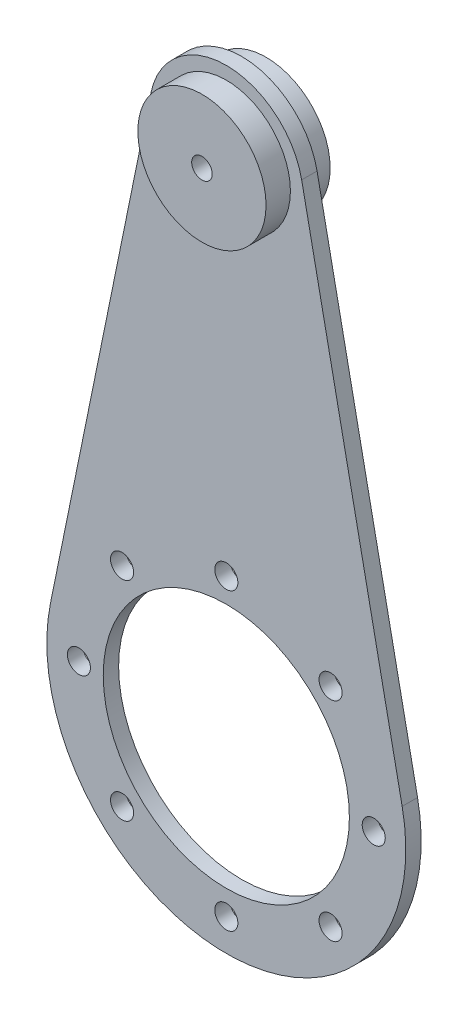
ISO-10303-21;
HEADER;
FILE_DESCRIPTION(('STEP AP214'),'2;1');
FILE_NAME('part.step','',(''),(''),'','','');
FILE_SCHEMA(('AUTOMOTIVE_DESIGN { 1 0 10303 214 1 1 1 1 }'));
ENDSEC;
DATA;
#1=APPLICATION_CONTEXT('core data for automotive mechanical design processes');
#2=APPLICATION_PROTOCOL_DEFINITION('international standard','automotive_design',2000,#1);
#3=PRODUCT_CONTEXT('',#1,'mechanical');
#4=PRODUCT('Part','Part','',(#3));
#5=PRODUCT_RELATED_PRODUCT_CATEGORY('part','',(#4));
#6=PRODUCT_DEFINITION_FORMATION('','',#4);
#7=PRODUCT_DEFINITION_CONTEXT('part definition',#1,'design');
#8=PRODUCT_DEFINITION('design','',#6,#7);
#9=PRODUCT_DEFINITION_SHAPE('','',#8);
#10=(LENGTH_UNIT() NAMED_UNIT(*) SI_UNIT(.MILLI.,.METRE.));
#11=(NAMED_UNIT(*) PLANE_ANGLE_UNIT() SI_UNIT($,.RADIAN.));
#12=(NAMED_UNIT(*) SI_UNIT($,.STERADIAN.) SOLID_ANGLE_UNIT());
#13=UNCERTAINTY_MEASURE_WITH_UNIT(LENGTH_MEASURE(1.E-05),#10,'distance_accuracy_value','');
#14=(GEOMETRIC_REPRESENTATION_CONTEXT(3) GLOBAL_UNCERTAINTY_ASSIGNED_CONTEXT((#13)) GLOBAL_UNIT_ASSIGNED_CONTEXT((#10,
#11,#12)) REPRESENTATION_CONTEXT('',''));
#15=CARTESIAN_POINT('',(0.,0.,0.));
#16=DIRECTION('',(0.,0.,1.));
#17=DIRECTION('',(1.,0.,0.));
#18=AXIS2_PLACEMENT_3D('',#15,#16,#17);
#19=CARTESIAN_POINT('',(0.,0.,-12.5));
#20=DIRECTION('',(0.,0.,1.));
#21=DIRECTION('',(1.,0.,0.));
#22=AXIS2_PLACEMENT_3D('',#19,#20,#21);
#23=PLANE('',#22);
#24=CARTESIAN_POINT('',(0.,200.,-12.5));
#25=DIRECTION('',(0.,0.,1.));
#26=DIRECTION('',(1.,0.,0.));
#27=AXIS2_PLACEMENT_3D('',#24,#25,#26);
#28=CIRCLE('',#27,4.);
#29=CARTESIAN_POINT('',(4.00000000000003,200.,-12.5));
#30=VERTEX_POINT('',#29);
#31=EDGE_CURVE('E20',#30,#30,#28,.T.);
#32=ORIENTED_EDGE('',*,*,#31,.T.);
#33=EDGE_LOOP('',(#32));
#34=FACE_BOUND('',#33,.T.);
#35=CARTESIAN_POINT('',(0.,200.,-12.5));
#36=DIRECTION('',(0.,0.,1.));
#37=DIRECTION('',(1.,0.,0.));
#38=AXIS2_PLACEMENT_3D('',#35,#36,#37);
#39=CIRCLE('',#38,25.);
#40=CARTESIAN_POINT('',(25.,200.,-12.5));
#41=VERTEX_POINT('',#40);
#42=EDGE_CURVE('E152',#41,#41,#39,.T.);
#43=ORIENTED_EDGE('',*,*,#42,.F.);
#44=EDGE_LOOP('',(#43));
#45=FACE_BOUND('',#44,.T.);
#46=ADVANCED_FACE('F17',(#34,#45),#23,.F.);
#47=CARTESIAN_POINT('',(0.,200.,-12.5));
#48=DIRECTION('',(0.,0.,1.));
#49=DIRECTION('',(1.,0.,0.));
#50=AXIS2_PLACEMENT_3D('',#47,#48,#49);
#51=CYLINDRICAL_SURFACE('',#50,4.);
#52=ORIENTED_EDGE('',*,*,#31,.F.);
#53=EDGE_LOOP('',(#52));
#54=FACE_BOUND('',#53,.T.);
#55=CARTESIAN_POINT('',(0.,200.,12.5));
#56=DIRECTION('',(0.,0.,1.));
#57=DIRECTION('',(1.,0.,0.));
#58=AXIS2_PLACEMENT_3D('',#55,#56,#57);
#59=CIRCLE('',#58,4.);
#60=CARTESIAN_POINT('',(4.00000000000003,200.,12.5));
#61=VERTEX_POINT('',#60);
#62=EDGE_CURVE('E150',#61,#61,#59,.F.);
#63=ORIENTED_EDGE('',*,*,#62,.F.);
#64=EDGE_LOOP('',(#63));
#65=FACE_BOUND('',#64,.T.);
#66=ADVANCED_FACE('F161',(#54,#65),#51,.F.);
#67=CARTESIAN_POINT('',(0.,200.,-12.5));
#68=DIRECTION('',(0.,0.,1.));
#69=DIRECTION('',(1.,0.,0.));
#70=AXIS2_PLACEMENT_3D('',#67,#68,#69);
#71=CYLINDRICAL_SURFACE('',#70,25.);
#72=ORIENTED_EDGE('',*,*,#42,.T.);
#73=EDGE_LOOP('',(#72));
#74=FACE_BOUND('',#73,.T.);
#75=CARTESIAN_POINT('',(0.,200.,-3.));
#76=DIRECTION('',(0.,0.,1.));
#77=DIRECTION('',(1.,0.,0.));
#78=AXIS2_PLACEMENT_3D('',#75,#76,#77);
#79=CIRCLE('',#78,25.);
#80=CARTESIAN_POINT('',(25.,200.,-3.));
#81=VERTEX_POINT('',#80);
#82=EDGE_CURVE('E65',#81,#81,#79,.F.);
#83=ORIENTED_EDGE('',*,*,#82,.T.);
#84=EDGE_LOOP('',(#83));
#85=FACE_BOUND('',#84,.T.);
#86=ADVANCED_FACE('F164',(#74,#85),#71,.T.);
#87=CARTESIAN_POINT('',(0.,0.,12.5));
#88=DIRECTION('',(0.,0.,1.));
#89=DIRECTION('',(1.,0.,0.));
#90=AXIS2_PLACEMENT_3D('',#87,#88,#89);
#91=PLANE('',#90);
#92=ORIENTED_EDGE('',*,*,#62,.T.);
#93=EDGE_LOOP('',(#92));
#94=FACE_BOUND('',#93,.T.);
#95=CARTESIAN_POINT('',(0.,200.,12.5));
#96=DIRECTION('',(0.,0.,1.));
#97=DIRECTION('',(1.,0.,0.));
#98=AXIS2_PLACEMENT_3D('',#95,#96,#97);
#99=CIRCLE('',#98,25.);
#100=CARTESIAN_POINT('',(25.,200.,12.5));
#101=VERTEX_POINT('',#100);
#102=EDGE_CURVE('E123',#101,#101,#99,.F.);
#103=ORIENTED_EDGE('',*,*,#102,.F.);
#104=EDGE_LOOP('',(#103));
#105=FACE_BOUND('',#104,.T.);
#106=ADVANCED_FACE('F167',(#94,#105),#91,.T.);
#107=CARTESIAN_POINT('',(0.,0.,-3.));
#108=DIRECTION('',(0.,0.,1.));
#109=DIRECTION('',(1.,0.,0.));
#110=AXIS2_PLACEMENT_3D('',#107,#108,#109);
#111=PLANE('',#110);
#112=CARTESIAN_POINT('',(57.5,0.,-3.));
#113=DIRECTION('',(0.,0.,1.));
#114=DIRECTION('',(1.,0.,0.));
#115=AXIS2_PLACEMENT_3D('',#112,#113,#114);
#116=CIRCLE('',#115,4.5);
#117=CARTESIAN_POINT('',(62.,0.,-3.));
#118=VERTEX_POINT('',#117);
#119=EDGE_CURVE('E117',#118,#118,#116,.T.);
#120=ORIENTED_EDGE('',*,*,#119,.T.);
#121=EDGE_LOOP('',(#120));
#122=FACE_BOUND('',#121,.T.);
#123=CARTESIAN_POINT('',(0.,0.,-3.));
#124=DIRECTION('',(0.,0.,1.));
#125=DIRECTION('',(1.,0.,0.));
#126=AXIS2_PLACEMENT_3D('',#123,#124,#125);
#127=CIRCLE('',#126,48.);
#128=CARTESIAN_POINT('',(48.,0.,-3.));
#129=VERTEX_POINT('',#128);
#130=EDGE_CURVE('E120',#129,#129,#127,.T.);
#131=ORIENTED_EDGE('',*,*,#130,.T.);
#132=EDGE_LOOP('',(#131));
#133=FACE_BOUND('',#132,.T.);
#134=ORIENTED_EDGE('',*,*,#82,.F.);
#135=EDGE_LOOP('',(#134));
#136=FACE_BOUND('',#135,.T.);
#137=CARTESIAN_POINT('',(40.6586399182265,-40.6586399182265,-3.));
#138=DIRECTION('',(0.,0.,1.));
#139=DIRECTION('',(1.,0.,0.));
#140=AXIS2_PLACEMENT_3D('',#137,#138,#139);
#141=CIRCLE('',#140,4.5);
#142=CARTESIAN_POINT('',(45.1586399182265,-40.6586399182265,-3.));
#143=VERTEX_POINT('',#142);
#144=EDGE_CURVE('E126',#143,#143,#141,.T.);
#145=ORIENTED_EDGE('',*,*,#144,.T.);
#146=EDGE_LOOP('',(#145));
#147=FACE_BOUND('',#146,.T.);
#148=CARTESIAN_POINT('',(0.,-57.5,-3.));
#149=DIRECTION('',(0.,0.,1.));
#150=DIRECTION('',(1.,0.,0.));
#151=AXIS2_PLACEMENT_3D('',#148,#149,#150);
#152=CIRCLE('',#151,4.5);
#153=CARTESIAN_POINT('',(4.49999999999999,-57.5,-3.));
#154=VERTEX_POINT('',#153);
#155=EDGE_CURVE('E129',#154,#154,#152,.T.);
#156=ORIENTED_EDGE('',*,*,#155,.T.);
#157=EDGE_LOOP('',(#156));
#158=FACE_BOUND('',#157,.T.);
#159=CARTESIAN_POINT('',(-40.6586399182265,-40.6586399182265,-3.));
#160=DIRECTION('',(0.,0.,1.));
#161=DIRECTION('',(1.,0.,0.));
#162=AXIS2_PLACEMENT_3D('',#159,#160,#161);
#163=CIRCLE('',#162,4.5);
#164=CARTESIAN_POINT('',(-36.1586399182265,-40.6586399182265,-3.));
#165=VERTEX_POINT('',#164);
#166=EDGE_CURVE('E132',#165,#165,#163,.T.);
#167=ORIENTED_EDGE('',*,*,#166,.T.);
#168=EDGE_LOOP('',(#167));
#169=FACE_BOUND('',#168,.T.);
#170=CARTESIAN_POINT('',(-57.5,0.,-3.));
#171=DIRECTION('',(0.,0.,1.));
#172=DIRECTION('',(1.,0.,0.));
#173=AXIS2_PLACEMENT_3D('',#170,#171,#172);
#174=CIRCLE('',#173,4.5);
#175=CARTESIAN_POINT('',(-53.,0.,-3.));
#176=VERTEX_POINT('',#175);
#177=EDGE_CURVE('E135',#176,#176,#174,.T.);
#178=ORIENTED_EDGE('',*,*,#177,.T.);
#179=EDGE_LOOP('',(#178));
#180=FACE_BOUND('',#179,.T.);
#181=CARTESIAN_POINT('',(-40.6586399182265,40.6586399182265,-3.));
#182=DIRECTION('',(0.,0.,1.));
#183=DIRECTION('',(1.,0.,0.));
#184=AXIS2_PLACEMENT_3D('',#181,#182,#183);
#185=CIRCLE('',#184,4.5);
#186=CARTESIAN_POINT('',(-36.1586399182265,40.6586399182265,-3.));
#187=VERTEX_POINT('',#186);
#188=EDGE_CURVE('E138',#187,#187,#185,.T.);
#189=ORIENTED_EDGE('',*,*,#188,.T.);
#190=EDGE_LOOP('',(#189));
#191=FACE_BOUND('',#190,.T.);
#192=CARTESIAN_POINT('',(0.,57.5,-3.));
#193=DIRECTION('',(0.,0.,1.));
#194=DIRECTION('',(1.,0.,0.));
#195=AXIS2_PLACEMENT_3D('',#192,#193,#194);
#196=CIRCLE('',#195,4.5);
#197=CARTESIAN_POINT('',(4.50000000000001,57.5,-3.));
#198=VERTEX_POINT('',#197);
#199=EDGE_CURVE('E141',#198,#198,#196,.T.);
#200=ORIENTED_EDGE('',*,*,#199,.T.);
#201=EDGE_LOOP('',(#200));
#202=FACE_BOUND('',#201,.T.);
#203=CARTESIAN_POINT('',(40.6586399182265,40.6586399182265,-3.));
#204=DIRECTION('',(0.,0.,1.));
#205=DIRECTION('',(1.,0.,0.));
#206=AXIS2_PLACEMENT_3D('',#203,#204,#205);
#207=CIRCLE('',#206,4.5);
#208=CARTESIAN_POINT('',(45.1586399182265,40.6586399182265,-3.));
#209=VERTEX_POINT('',#208);
#210=EDGE_CURVE('E144',#209,#209,#207,.T.);
#211=ORIENTED_EDGE('',*,*,#210,.T.);
#212=EDGE_LOOP('',(#211));
#213=FACE_BOUND('',#212,.T.);
#214=CARTESIAN_POINT('',(0.,200.,-3.));
#215=DIRECTION('',(0.,0.,1.));
#216=DIRECTION('',(1.,0.,0.));
#217=AXIS2_PLACEMENT_3D('',#214,#215,#216);
#218=CIRCLE('',#217,30.);
#219=CARTESIAN_POINT('',(29.3938769133968,206.000000000007,-3.));
#220=VERTEX_POINT('',#219);
#221=CARTESIAN_POINT('',(-29.3938769133966,206.000000000007,-3.));
#222=VERTEX_POINT('',#221);
#223=EDGE_CURVE('E79',#220,#222,#218,.T.);
#224=ORIENTED_EDGE('',*,*,#223,.F.);
#225=DIRECTION('',(-0.200000000000448,0.97979589711318,0.));
#226=VECTOR('',#225,1.);
#227=CARTESIAN_POINT('',(68.5857127980534,13.9999999998386,-3.));
#228=LINE('',#227,#226);
#229=CARTESIAN_POINT('',(68.5857127980319,13.9999999999439,-3.));
#230=VERTEX_POINT('',#229);
#231=EDGE_CURVE('E62',#230,#220,#228,.T.);
#232=ORIENTED_EDGE('',*,*,#231,.F.);
#233=CARTESIAN_POINT('',(0.,0.,-3.));
#234=DIRECTION('',(0.,0.,1.));
#235=DIRECTION('',(1.,0.,0.));
#236=AXIS2_PLACEMENT_3D('',#233,#234,#235);
#237=CIRCLE('',#236,70.);
#238=CARTESIAN_POINT('',(-68.5857127980319,13.999999999944,-3.));
#239=VERTEX_POINT('',#238);
#240=EDGE_CURVE('E56',#239,#230,#237,.T.);
#241=ORIENTED_EDGE('',*,*,#240,.F.);
#242=DIRECTION('',(-0.200000000000449,-0.97979589711318,0.));
#243=VECTOR('',#242,1.);
#244=CARTESIAN_POINT('',(-29.393876913398,206.,-3.));
#245=LINE('',#244,#243);
#246=EDGE_CURVE('E60',#222,#239,#245,.T.);
#247=ORIENTED_EDGE('',*,*,#246,.F.);
#248=EDGE_LOOP('',(#224,#232,#241,#247));
#249=FACE_BOUND('',#248,.T.);
#250=ADVANCED_FACE('F58',(#122,#133,#136,#147,#158,#169,#180,#191,#202,#213,#249),#111,.F.);
#251=CARTESIAN_POINT('',(0.,0.,-3.));
#252=DIRECTION('',(0.,0.,1.));
#253=DIRECTION('',(1.,0.,0.));
#254=AXIS2_PLACEMENT_3D('',#251,#252,#253);
#255=CYLINDRICAL_SURFACE('',#254,70.);
#256=CARTESIAN_POINT('',(0.,0.,3.));
#257=DIRECTION('',(0.,0.,1.));
#258=DIRECTION('',(1.,0.,0.));
#259=AXIS2_PLACEMENT_3D('',#256,#257,#258);
#260=CIRCLE('',#259,70.);
#261=CARTESIAN_POINT('',(-68.5857127979912,13.9999999999194,3.));
#262=VERTEX_POINT('',#261);
#263=CARTESIAN_POINT('',(68.5857127980319,13.9999999999439,3.));
#264=VERTEX_POINT('',#263);
#265=EDGE_CURVE('E71',#262,#264,#260,.T.);
#266=ORIENTED_EDGE('',*,*,#265,.F.);
#267=DIRECTION('',(0.,0.,1.));
#268=VECTOR('',#267,1.);
#269=CARTESIAN_POINT('',(-68.5857127980534,13.9999999998387,-3.));
#270=LINE('',#269,#268);
#271=EDGE_CURVE('E68',#239,#262,#270,.T.);
#272=ORIENTED_EDGE('',*,*,#271,.F.);
#273=ORIENTED_EDGE('',*,*,#240,.T.);
#274=DIRECTION('',(0.,0.,1.));
#275=VECTOR('',#274,1.);
#276=CARTESIAN_POINT('',(68.5857127980534,13.9999999998386,-3.));
#277=LINE('',#276,#275);
#278=EDGE_CURVE('E83',#264,#230,#277,.F.);
#279=ORIENTED_EDGE('',*,*,#278,.F.);
#280=EDGE_LOOP('',(#266,#272,#273,#279));
#281=FACE_BOUND('',#280,.T.);
#282=ADVANCED_FACE('F69',(#281),#255,.T.);
#283=CARTESIAN_POINT('',(68.5857127980534,13.9999999998386,-3.));
#284=DIRECTION('',(0.97979589711318,0.200000000000448,0.));
#285=DIRECTION('',(-0.200000000000448,0.97979589711318,0.));
#286=AXIS2_PLACEMENT_3D('',#283,#284,#285);
#287=PLANE('',#286);
#288=DIRECTION('',(-0.200000000000448,0.97979589711318,0.));
#289=VECTOR('',#288,1.);
#290=CARTESIAN_POINT('',(68.5857127980534,13.9999999998386,3.));
#291=LINE('',#290,#289);
#292=CARTESIAN_POINT('',(29.3938769133967,206.000000000007,3.));
#293=VERTEX_POINT('',#292);
#294=EDGE_CURVE('E115',#264,#293,#291,.T.);
#295=ORIENTED_EDGE('',*,*,#294,.F.);
#296=ORIENTED_EDGE('',*,*,#278,.T.);
#297=ORIENTED_EDGE('',*,*,#231,.T.);
#298=DIRECTION('',(0.,0.,1.));
#299=VECTOR('',#298,1.);
#300=CARTESIAN_POINT('',(29.3938769133982,206.,-3.));
#301=LINE('',#300,#299);
#302=EDGE_CURVE('E76',#293,#220,#301,.F.);
#303=ORIENTED_EDGE('',*,*,#302,.F.);
#304=EDGE_LOOP('',(#295,#296,#297,#303));
#305=FACE_BOUND('',#304,.T.);
#306=ADVANCED_FACE('F223',(#305),#287,.T.);
#307=CARTESIAN_POINT('',(0.,200.,-3.));
#308=DIRECTION('',(0.,0.,1.));
#309=DIRECTION('',(1.,0.,0.));
#310=AXIS2_PLACEMENT_3D('',#307,#308,#309);
#311=CYLINDRICAL_SURFACE('',#310,30.);
#312=CARTESIAN_POINT('',(0.,200.,3.));
#313=DIRECTION('',(0.,0.,1.));
#314=DIRECTION('',(1.,0.,0.));
#315=AXIS2_PLACEMENT_3D('',#312,#313,#314);
#316=CIRCLE('',#315,30.);
#317=CARTESIAN_POINT('',(-29.393876913398,206.,3.));
#318=VERTEX_POINT('',#317);
#319=EDGE_CURVE('E112',#293,#318,#316,.T.);
#320=ORIENTED_EDGE('',*,*,#319,.F.);
#321=ORIENTED_EDGE('',*,*,#302,.T.);
#322=ORIENTED_EDGE('',*,*,#223,.T.);
#323=DIRECTION('',(0.,0.,1.));
#324=VECTOR('',#323,1.);
#325=CARTESIAN_POINT('',(-29.393876913398,206.,-3.));
#326=LINE('',#325,#324);
#327=EDGE_CURVE('E35',#318,#222,#326,.F.);
#328=ORIENTED_EDGE('',*,*,#327,.F.);
#329=EDGE_LOOP('',(#320,#321,#322,#328));
#330=FACE_BOUND('',#329,.T.);
#331=ADVANCED_FACE('F221',(#330),#311,.T.);
#332=CARTESIAN_POINT('',(-29.393876913398,206.,-3.));
#333=DIRECTION('',(-0.97979589711318,0.200000000000449,0.));
#334=DIRECTION('',(-0.200000000000449,-0.97979589711318,0.));
#335=AXIS2_PLACEMENT_3D('',#332,#333,#334);
#336=PLANE('',#335);
#337=DIRECTION('',(-0.200000000000001,-0.979795897113271,0.));
#338=VECTOR('',#337,1.);
#339=CARTESIAN_POINT('',(-29.393876913398,206.,3.));
#340=LINE('',#339,#338);
#341=EDGE_CURVE('E111',#318,#262,#340,.T.);
#342=ORIENTED_EDGE('',*,*,#341,.F.);
#343=ORIENTED_EDGE('',*,*,#327,.T.);
#344=ORIENTED_EDGE('',*,*,#246,.T.);
#345=ORIENTED_EDGE('',*,*,#271,.T.);
#346=EDGE_LOOP('',(#342,#343,#344,#345));
#347=FACE_BOUND('',#346,.T.);
#348=ADVANCED_FACE('F75',(#347),#336,.T.);
#349=CARTESIAN_POINT('',(40.6586399182265,40.6586399182265,-12.5));
#350=DIRECTION('',(0.,0.,1.));
#351=DIRECTION('',(1.,0.,0.));
#352=AXIS2_PLACEMENT_3D('',#349,#350,#351);
#353=CYLINDRICAL_SURFACE('',#352,4.5);
#354=ORIENTED_EDGE('',*,*,#210,.F.);
#355=EDGE_LOOP('',(#354));
#356=FACE_BOUND('',#355,.T.);
#357=CARTESIAN_POINT('',(40.6586399182265,40.6586399182265,3.));
#358=DIRECTION('',(0.,0.,1.));
#359=DIRECTION('',(1.,0.,0.));
#360=AXIS2_PLACEMENT_3D('',#357,#358,#359);
#361=CIRCLE('',#360,4.5);
#362=CARTESIAN_POINT('',(45.1586399182265,40.6586399182265,3.));
#363=VERTEX_POINT('',#362);
#364=EDGE_CURVE('E108',#363,#363,#361,.F.);
#365=ORIENTED_EDGE('',*,*,#364,.F.);
#366=EDGE_LOOP('',(#365));
#367=FACE_BOUND('',#366,.T.);
#368=ADVANCED_FACE('F261',(#356,#367),#353,.F.);
#369=CARTESIAN_POINT('',(0.,57.5,-12.5));
#370=DIRECTION('',(0.,0.,1.));
#371=DIRECTION('',(1.,0.,0.));
#372=AXIS2_PLACEMENT_3D('',#369,#370,#371);
#373=CYLINDRICAL_SURFACE('',#372,4.5);
#374=ORIENTED_EDGE('',*,*,#199,.F.);
#375=EDGE_LOOP('',(#374));
#376=FACE_BOUND('',#375,.T.);
#377=CARTESIAN_POINT('',(0.,57.5,3.));
#378=DIRECTION('',(0.,0.,1.));
#379=DIRECTION('',(1.,0.,0.));
#380=AXIS2_PLACEMENT_3D('',#377,#378,#379);
#381=CIRCLE('',#380,4.5);
#382=CARTESIAN_POINT('',(4.50000000000001,57.5,3.));
#383=VERTEX_POINT('',#382);
#384=EDGE_CURVE('E105',#383,#383,#381,.F.);
#385=ORIENTED_EDGE('',*,*,#384,.F.);
#386=EDGE_LOOP('',(#385));
#387=FACE_BOUND('',#386,.T.);
#388=ADVANCED_FACE('F264',(#376,#387),#373,.F.);
#389=CARTESIAN_POINT('',(-40.6586399182265,40.6586399182265,-12.5));
#390=DIRECTION('',(0.,0.,1.));
#391=DIRECTION('',(1.,0.,0.));
#392=AXIS2_PLACEMENT_3D('',#389,#390,#391);
#393=CYLINDRICAL_SURFACE('',#392,4.5);
#394=ORIENTED_EDGE('',*,*,#188,.F.);
#395=EDGE_LOOP('',(#394));
#396=FACE_BOUND('',#395,.T.);
#397=CARTESIAN_POINT('',(-40.6586399182265,40.6586399182265,3.));
#398=DIRECTION('',(0.,0.,1.));
#399=DIRECTION('',(1.,0.,0.));
#400=AXIS2_PLACEMENT_3D('',#397,#398,#399);
#401=CIRCLE('',#400,4.5);
#402=CARTESIAN_POINT('',(-36.1586399182265,40.6586399182265,3.));
#403=VERTEX_POINT('',#402);
#404=EDGE_CURVE('E102',#403,#403,#401,.F.);
#405=ORIENTED_EDGE('',*,*,#404,.F.);
#406=EDGE_LOOP('',(#405));
#407=FACE_BOUND('',#406,.T.);
#408=ADVANCED_FACE('F270',(#396,#407),#393,.F.);
#409=CARTESIAN_POINT('',(-57.5,0.,-12.5));
#410=DIRECTION('',(0.,0.,1.));
#411=DIRECTION('',(1.,0.,0.));
#412=AXIS2_PLACEMENT_3D('',#409,#410,#411);
#413=CYLINDRICAL_SURFACE('',#412,4.5);
#414=ORIENTED_EDGE('',*,*,#177,.F.);
#415=EDGE_LOOP('',(#414));
#416=FACE_BOUND('',#415,.T.);
#417=CARTESIAN_POINT('',(-57.5,0.,3.));
#418=DIRECTION('',(0.,0.,1.));
#419=DIRECTION('',(1.,0.,0.));
#420=AXIS2_PLACEMENT_3D('',#417,#418,#419);
#421=CIRCLE('',#420,4.5);
#422=CARTESIAN_POINT('',(-53.,0.,3.));
#423=VERTEX_POINT('',#422);
#424=EDGE_CURVE('E99',#423,#423,#421,.F.);
#425=ORIENTED_EDGE('',*,*,#424,.F.);
#426=EDGE_LOOP('',(#425));
#427=FACE_BOUND('',#426,.T.);
#428=ADVANCED_FACE('F276',(#416,#427),#413,.F.);
#429=CARTESIAN_POINT('',(-40.6586399182265,-40.6586399182265,-12.5));
#430=DIRECTION('',(0.,0.,1.));
#431=DIRECTION('',(1.,0.,0.));
#432=AXIS2_PLACEMENT_3D('',#429,#430,#431);
#433=CYLINDRICAL_SURFACE('',#432,4.5);
#434=ORIENTED_EDGE('',*,*,#166,.F.);
#435=EDGE_LOOP('',(#434));
#436=FACE_BOUND('',#435,.T.);
#437=CARTESIAN_POINT('',(-40.6586399182265,-40.6586399182265,3.));
#438=DIRECTION('',(0.,0.,1.));
#439=DIRECTION('',(1.,0.,0.));
#440=AXIS2_PLACEMENT_3D('',#437,#438,#439);
#441=CIRCLE('',#440,4.5);
#442=CARTESIAN_POINT('',(-36.1586399182265,-40.6586399182265,3.));
#443=VERTEX_POINT('',#442);
#444=EDGE_CURVE('E96',#443,#443,#441,.F.);
#445=ORIENTED_EDGE('',*,*,#444,.F.);
#446=EDGE_LOOP('',(#445));
#447=FACE_BOUND('',#446,.T.);
#448=ADVANCED_FACE('F280',(#436,#447),#433,.F.);
#449=CARTESIAN_POINT('',(0.,-57.5,-12.5));
#450=DIRECTION('',(0.,0.,1.));
#451=DIRECTION('',(1.,0.,0.));
#452=AXIS2_PLACEMENT_3D('',#449,#450,#451);
#453=CYLINDRICAL_SURFACE('',#452,4.5);
#454=ORIENTED_EDGE('',*,*,#155,.F.);
#455=EDGE_LOOP('',(#454));
#456=FACE_BOUND('',#455,.T.);
#457=CARTESIAN_POINT('',(0.,-57.5,3.));
#458=DIRECTION('',(0.,0.,1.));
#459=DIRECTION('',(1.,0.,0.));
#460=AXIS2_PLACEMENT_3D('',#457,#458,#459);
#461=CIRCLE('',#460,4.5);
#462=CARTESIAN_POINT('',(4.49999999999999,-57.5,3.));
#463=VERTEX_POINT('',#462);
#464=EDGE_CURVE('E93',#463,#463,#461,.F.);
#465=ORIENTED_EDGE('',*,*,#464,.F.);
#466=EDGE_LOOP('',(#465));
#467=FACE_BOUND('',#466,.T.);
#468=ADVANCED_FACE('F187',(#456,#467),#453,.F.);
#469=CARTESIAN_POINT('',(40.6586399182265,-40.6586399182265,-12.5));
#470=DIRECTION('',(0.,0.,1.));
#471=DIRECTION('',(1.,0.,0.));
#472=AXIS2_PLACEMENT_3D('',#469,#470,#471);
#473=CYLINDRICAL_SURFACE('',#472,4.5);
#474=ORIENTED_EDGE('',*,*,#144,.F.);
#475=EDGE_LOOP('',(#474));
#476=FACE_BOUND('',#475,.T.);
#477=CARTESIAN_POINT('',(40.6586399182265,-40.6586399182265,3.));
#478=DIRECTION('',(0.,0.,1.));
#479=DIRECTION('',(1.,0.,0.));
#480=AXIS2_PLACEMENT_3D('',#477,#478,#479);
#481=CIRCLE('',#480,4.5);
#482=CARTESIAN_POINT('',(45.1586399182265,-40.6586399182265,3.));
#483=VERTEX_POINT('',#482);
#484=EDGE_CURVE('E90',#483,#483,#481,.F.);
#485=ORIENTED_EDGE('',*,*,#484,.F.);
#486=EDGE_LOOP('',(#485));
#487=FACE_BOUND('',#486,.T.);
#488=ADVANCED_FACE('F176',(#476,#487),#473,.F.);
#489=CARTESIAN_POINT('',(0.,200.,-12.5));
#490=DIRECTION('',(0.,0.,1.));
#491=DIRECTION('',(1.,0.,0.));
#492=AXIS2_PLACEMENT_3D('',#489,#490,#491);
#493=CYLINDRICAL_SURFACE('',#492,25.);
#494=CARTESIAN_POINT('',(0.,200.,3.));
#495=DIRECTION('',(0.,0.,1.));
#496=DIRECTION('',(1.,0.,0.));
#497=AXIS2_PLACEMENT_3D('',#494,#495,#496);
#498=CIRCLE('',#497,25.);
#499=CARTESIAN_POINT('',(25.,200.,3.));
#500=VERTEX_POINT('',#499);
#501=EDGE_CURVE('E87',#500,#500,#498,.F.);
#502=ORIENTED_EDGE('',*,*,#501,.F.);
#503=EDGE_LOOP('',(#502));
#504=FACE_BOUND('',#503,.T.);
#505=ORIENTED_EDGE('',*,*,#102,.T.);
#506=EDGE_LOOP('',(#505));
#507=FACE_BOUND('',#506,.T.);
#508=ADVANCED_FACE('F173',(#504,#507),#493,.T.);
#509=CARTESIAN_POINT('',(0.,0.,-3.));
#510=DIRECTION('',(0.,0.,1.));
#511=DIRECTION('',(1.,0.,0.));
#512=AXIS2_PLACEMENT_3D('',#509,#510,#511);
#513=CYLINDRICAL_SURFACE('',#512,48.);
#514=ORIENTED_EDGE('',*,*,#130,.F.);
#515=EDGE_LOOP('',(#514));
#516=FACE_BOUND('',#515,.T.);
#517=CARTESIAN_POINT('',(0.,0.,3.));
#518=DIRECTION('',(0.,0.,1.));
#519=DIRECTION('',(1.,0.,0.));
#520=AXIS2_PLACEMENT_3D('',#517,#518,#519);
#521=CIRCLE('',#520,48.);
#522=CARTESIAN_POINT('',(48.,0.,3.));
#523=VERTEX_POINT('',#522);
#524=EDGE_CURVE('E26',#523,#523,#521,.F.);
#525=ORIENTED_EDGE('',*,*,#524,.F.);
#526=EDGE_LOOP('',(#525));
#527=FACE_BOUND('',#526,.T.);
#528=ADVANCED_FACE('F175',(#516,#527),#513,.F.);
#529=CARTESIAN_POINT('',(57.5,0.,-12.5));
#530=DIRECTION('',(0.,0.,1.));
#531=DIRECTION('',(1.,0.,0.));
#532=AXIS2_PLACEMENT_3D('',#529,#530,#531);
#533=CYLINDRICAL_SURFACE('',#532,4.5);
#534=ORIENTED_EDGE('',*,*,#119,.F.);
#535=EDGE_LOOP('',(#534));
#536=FACE_BOUND('',#535,.T.);
#537=CARTESIAN_POINT('',(57.5,0.,3.));
#538=DIRECTION('',(0.,0.,1.));
#539=DIRECTION('',(1.,0.,0.));
#540=AXIS2_PLACEMENT_3D('',#537,#538,#539);
#541=CIRCLE('',#540,4.5);
#542=CARTESIAN_POINT('',(62.,0.,3.));
#543=VERTEX_POINT('',#542);
#544=EDGE_CURVE('E11',#543,#543,#541,.F.);
#545=ORIENTED_EDGE('',*,*,#544,.F.);
#546=EDGE_LOOP('',(#545));
#547=FACE_BOUND('',#546,.T.);
#548=ADVANCED_FACE('F184',(#536,#547),#533,.F.);
#549=CARTESIAN_POINT('',(0.,0.,3.));
#550=DIRECTION('',(0.,0.,1.));
#551=DIRECTION('',(1.,0.,0.));
#552=AXIS2_PLACEMENT_3D('',#549,#550,#551);
#553=PLANE('',#552);
#554=ORIENTED_EDGE('',*,*,#544,.T.);
#555=EDGE_LOOP('',(#554));
#556=FACE_BOUND('',#555,.T.);
#557=ORIENTED_EDGE('',*,*,#524,.T.);
#558=EDGE_LOOP('',(#557));
#559=FACE_BOUND('',#558,.T.);
#560=ORIENTED_EDGE('',*,*,#501,.T.);
#561=EDGE_LOOP('',(#560));
#562=FACE_BOUND('',#561,.T.);
#563=ORIENTED_EDGE('',*,*,#484,.T.);
#564=EDGE_LOOP('',(#563));
#565=FACE_BOUND('',#564,.T.);
#566=ORIENTED_EDGE('',*,*,#464,.T.);
#567=EDGE_LOOP('',(#566));
#568=FACE_BOUND('',#567,.T.);
#569=ORIENTED_EDGE('',*,*,#444,.T.);
#570=EDGE_LOOP('',(#569));
#571=FACE_BOUND('',#570,.T.);
#572=ORIENTED_EDGE('',*,*,#424,.T.);
#573=EDGE_LOOP('',(#572));
#574=FACE_BOUND('',#573,.T.);
#575=ORIENTED_EDGE('',*,*,#404,.T.);
#576=EDGE_LOOP('',(#575));
#577=FACE_BOUND('',#576,.T.);
#578=ORIENTED_EDGE('',*,*,#384,.T.);
#579=EDGE_LOOP('',(#578));
#580=FACE_BOUND('',#579,.T.);
#581=ORIENTED_EDGE('',*,*,#364,.T.);
#582=EDGE_LOOP('',(#581));
#583=FACE_BOUND('',#582,.T.);
#584=ORIENTED_EDGE('',*,*,#319,.T.);
#585=ORIENTED_EDGE('',*,*,#341,.T.);
#586=ORIENTED_EDGE('',*,*,#265,.T.);
#587=ORIENTED_EDGE('',*,*,#294,.T.);
#588=EDGE_LOOP('',(#584,#585,#586,#587));
#589=FACE_BOUND('',#588,.T.);
#590=ADVANCED_FACE('F191',(#556,#559,#562,#565,#568,#571,#574,#577,#580,#583,#589),#553,.T.);
#591=CLOSED_SHELL('',(#46,#66,#86,#106,#250,#282,#306,#331,#348,#368,#388,#408,#428,#448,#468,
#488,#508,#528,#548,#590));
#592=MANIFOLD_SOLID_BREP('B1',#591);
#593=ADVANCED_BREP_SHAPE_REPRESENTATION('',(#18,#592),#14);
#594=SHAPE_DEFINITION_REPRESENTATION(#9,#593);
ENDSEC;
END-ISO-10303-21;
